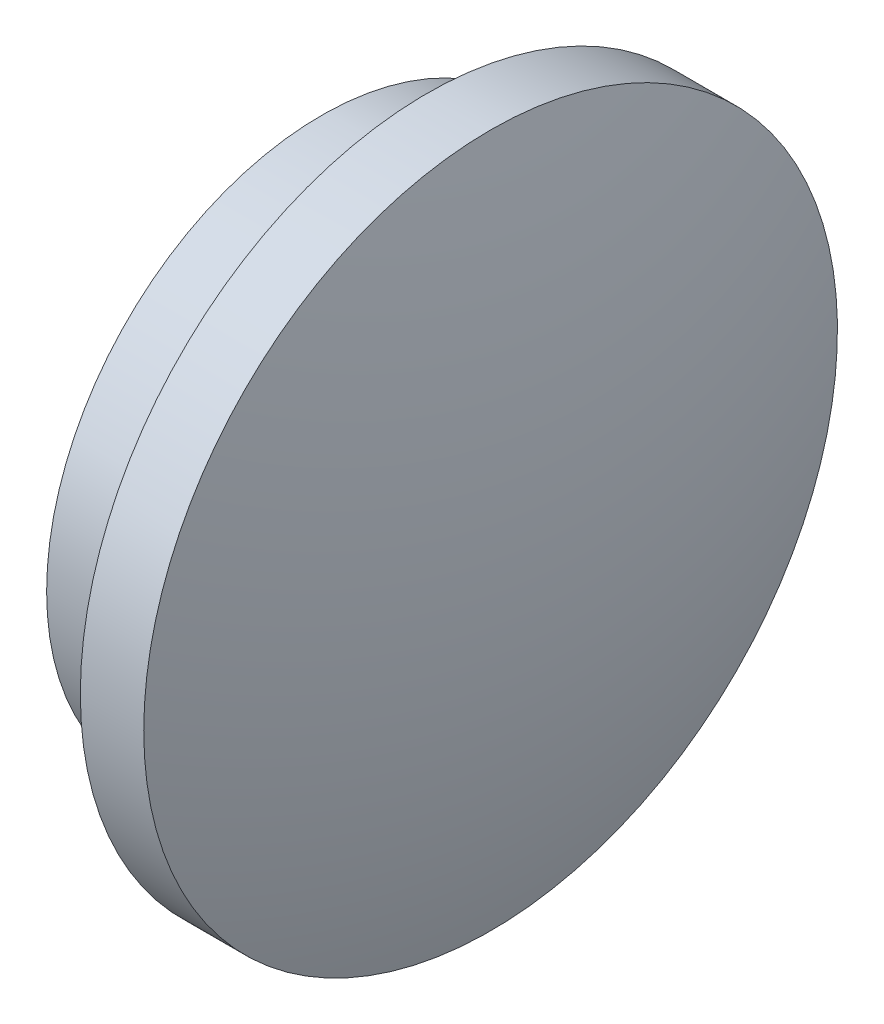
ISO-10303-21;
HEADER;
FILE_DESCRIPTION(('STEP AP214'),'2;1');
FILE_NAME('part.step','',(''),(''),'','','');
FILE_SCHEMA(('AUTOMOTIVE_DESIGN { 1 0 10303 214 1 1 1 1 }'));
ENDSEC;
DATA;
#1=APPLICATION_CONTEXT('core data for automotive mechanical design processes');
#2=APPLICATION_PROTOCOL_DEFINITION('international standard','automotive_design',2000,#1);
#3=PRODUCT_CONTEXT('',#1,'mechanical');
#4=PRODUCT('Part','Part','',(#3));
#5=PRODUCT_RELATED_PRODUCT_CATEGORY('part','',(#4));
#6=PRODUCT_DEFINITION_FORMATION('','',#4);
#7=PRODUCT_DEFINITION_CONTEXT('part definition',#1,'design');
#8=PRODUCT_DEFINITION('design','',#6,#7);
#9=PRODUCT_DEFINITION_SHAPE('','',#8);
#10=(LENGTH_UNIT() NAMED_UNIT(*) SI_UNIT(.MILLI.,.METRE.));
#11=(NAMED_UNIT(*) PLANE_ANGLE_UNIT() SI_UNIT($,.RADIAN.));
#12=(NAMED_UNIT(*) SI_UNIT($,.STERADIAN.) SOLID_ANGLE_UNIT());
#13=UNCERTAINTY_MEASURE_WITH_UNIT(LENGTH_MEASURE(1.E-05),#10,'distance_accuracy_value','');
#14=(GEOMETRIC_REPRESENTATION_CONTEXT(3) GLOBAL_UNCERTAINTY_ASSIGNED_CONTEXT((#13)) GLOBAL_UNIT_ASSIGNED_CONTEXT((#10,
#11,#12)) REPRESENTATION_CONTEXT('',''));
#15=CARTESIAN_POINT('',(0.,0.,0.));
#16=DIRECTION('',(0.,0.,1.));
#17=DIRECTION('',(1.,0.,0.));
#18=AXIS2_PLACEMENT_3D('',#15,#16,#17);
#19=CARTESIAN_POINT('',(-12.5777908705026,0.,0.));
#20=DIRECTION('',(1.,0.,0.));
#21=DIRECTION('',(0.,0.,-1.));
#22=AXIS2_PLACEMENT_3D('',#19,#20,#21);
#23=PLANE('',#22);
#24=CARTESIAN_POINT('',(-12.5777908705026,0.,0.));
#25=DIRECTION('',(-1.,0.,0.));
#26=DIRECTION('',(0.,0.,1.));
#27=AXIS2_PLACEMENT_3D('',#24,#25,#26);
#28=CIRCLE('',#27,26.);
#29=CARTESIAN_POINT('',(-12.5777908705026,0.,26.));
#30=VERTEX_POINT('',#29);
#31=EDGE_CURVE('E10',#30,#30,#28,.T.);
#32=ORIENTED_EDGE('',*,*,#31,.T.);
#33=EDGE_LOOP('',(#32));
#34=FACE_BOUND('',#33,.T.);
#35=ADVANCED_FACE('F31',(#34),#23,.F.);
#36=CARTESIAN_POINT('',(-44.9214659685864,0.,0.));
#37=DIRECTION('',(-1.,0.,0.));
#38=DIRECTION('',(0.,0.,1.));
#39=AXIS2_PLACEMENT_3D('',#36,#37,#38);
#40=CYLINDRICAL_SURFACE('',#39,26.);
#41=ORIENTED_EDGE('',*,*,#31,.F.);
#42=EDGE_LOOP('',(#41));
#43=FACE_BOUND('',#42,.T.);
#44=CARTESIAN_POINT('',(-2.57779087050258,0.,0.));
#45=DIRECTION('',(-1.,0.,0.));
#46=DIRECTION('',(0.,0.,1.));
#47=AXIS2_PLACEMENT_3D('',#44,#45,#46);
#48=CIRCLE('',#47,26.);
#49=CARTESIAN_POINT('',(-2.57779087050258,0.,26.));
#50=VERTEX_POINT('',#49);
#51=EDGE_CURVE('E37',#50,#50,#48,.T.);
#52=ORIENTED_EDGE('',*,*,#51,.T.);
#53=EDGE_LOOP('',(#52));
#54=FACE_BOUND('',#53,.T.);
#55=ADVANCED_FACE('F63',(#43,#54),#40,.T.);
#56=CARTESIAN_POINT('',(-2.57779087050258,26.,0.));
#57=DIRECTION('',(1.,0.,0.));
#58=DIRECTION('',(0.,0.,-1.));
#59=AXIS2_PLACEMENT_3D('',#56,#57,#58);
#60=PLANE('',#59);
#61=ORIENTED_EDGE('',*,*,#51,.F.);
#62=EDGE_LOOP('',(#61));
#63=FACE_BOUND('',#62,.T.);
#64=CARTESIAN_POINT('',(-2.57779087050258,0.,0.));
#65=DIRECTION('',(-1.,0.,0.));
#66=DIRECTION('',(0.,0.,1.));
#67=AXIS2_PLACEMENT_3D('',#64,#65,#66);
#68=CIRCLE('',#67,32.8126834469767);
#69=CARTESIAN_POINT('',(-2.57779087050258,0.,32.8126834469767));
#70=VERTEX_POINT('',#69);
#71=EDGE_CURVE('E41',#70,#70,#68,.T.);
#72=ORIENTED_EDGE('',*,*,#71,.T.);
#73=EDGE_LOOP('',(#72));
#74=FACE_BOUND('',#73,.T.);
#75=ADVANCED_FACE('F59',(#63,#74),#60,.F.);
#76=CARTESIAN_POINT('',(-44.9214659685864,0.,0.));
#77=DIRECTION('',(-1.,0.,0.));
#78=DIRECTION('',(0.,0.,1.));
#79=AXIS2_PLACEMENT_3D('',#76,#77,#78);
#80=CYLINDRICAL_SURFACE('',#79,32.8126834469767);
#81=ORIENTED_EDGE('',*,*,#71,.F.);
#82=EDGE_LOOP('',(#81));
#83=FACE_BOUND('',#82,.T.);
#84=CARTESIAN_POINT('',(3.42220912949742,0.,0.));
#85=DIRECTION('',(-1.,0.,0.));
#86=DIRECTION('',(0.,0.,1.));
#87=AXIS2_PLACEMENT_3D('',#84,#85,#86);
#88=CIRCLE('',#87,32.8126834469767);
#89=CARTESIAN_POINT('',(3.42220912949742,0.,32.8126834469767));
#90=VERTEX_POINT('',#89);
#91=EDGE_CURVE('E45',#90,#90,#88,.T.);
#92=ORIENTED_EDGE('',*,*,#91,.T.);
#93=EDGE_LOOP('',(#92));
#94=FACE_BOUND('',#93,.T.);
#95=ADVANCED_FACE('F51',(#83,#94),#80,.T.);
#96=CARTESIAN_POINT('',(-97.1265083098373,0.,0.));
#97=DIRECTION('',(-1.,0.,0.));
#98=DIRECTION('',(0.,1.,0.));
#99=AXIS2_PLACEMENT_3D('',#96,#97,#98);
#100=SPHERICAL_SURFACE('',#99,105.767276478534);
#101=ORIENTED_EDGE('',*,*,#91,.F.);
#102=EDGE_LOOP('',(#101));
#103=FACE_BOUND('',#102,.T.);
#104=ADVANCED_FACE('F53',(#103),#100,.T.);
#105=CLOSED_SHELL('',(#35,#55,#75,#95,#104));
#106=MANIFOLD_SOLID_BREP('B2',#105);
#107=ADVANCED_BREP_SHAPE_REPRESENTATION('',(#18,#106),#14);
#108=SHAPE_DEFINITION_REPRESENTATION(#9,#107);
ENDSEC;
END-ISO-10303-21;
